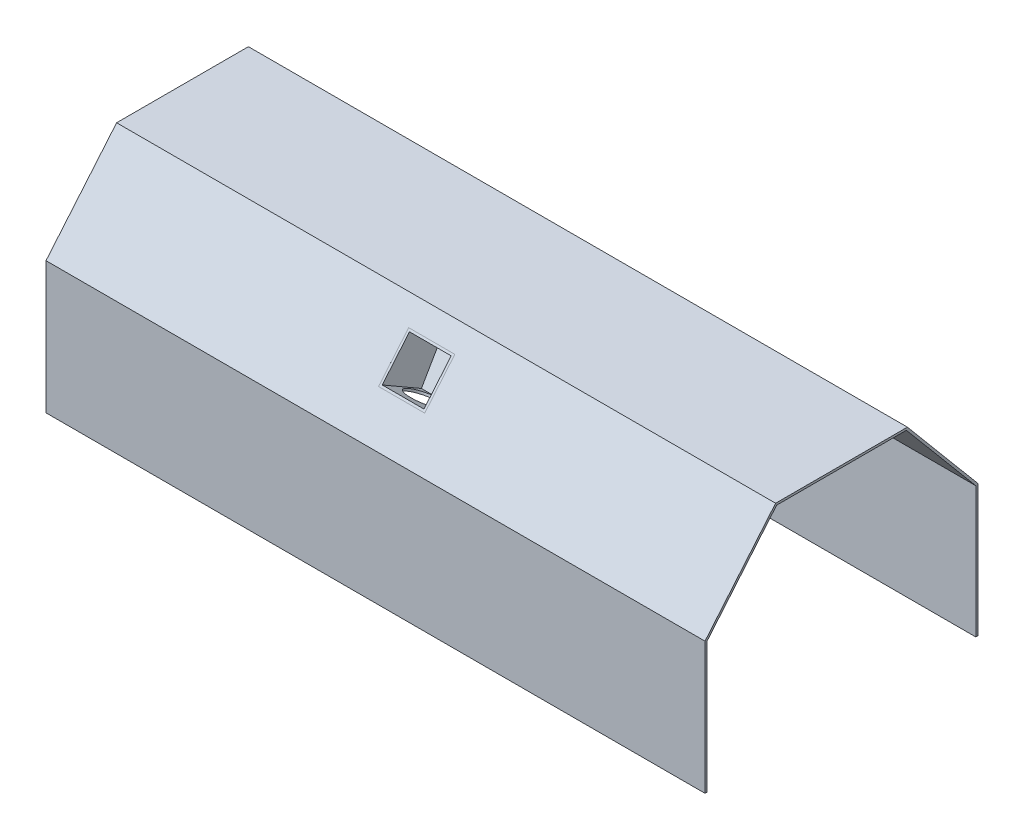
ISO-10303-21;
HEADER;
FILE_DESCRIPTION(('STEP AP214'),'2;1');
FILE_NAME('part.step','',(''),(''),'','','');
FILE_SCHEMA(('AUTOMOTIVE_DESIGN { 1 0 10303 214 1 1 1 1 }'));
ENDSEC;
DATA;
#1=APPLICATION_CONTEXT('core data for automotive mechanical design processes');
#2=APPLICATION_PROTOCOL_DEFINITION('international standard','automotive_design',2000,#1);
#3=PRODUCT_CONTEXT('',#1,'mechanical');
#4=PRODUCT('Part','Part','',(#3));
#5=PRODUCT_RELATED_PRODUCT_CATEGORY('part','',(#4));
#6=PRODUCT_DEFINITION_FORMATION('','',#4);
#7=PRODUCT_DEFINITION_CONTEXT('part definition',#1,'design');
#8=PRODUCT_DEFINITION('design','',#6,#7);
#9=PRODUCT_DEFINITION_SHAPE('','',#8);
#10=(LENGTH_UNIT() NAMED_UNIT(*) SI_UNIT(.MILLI.,.METRE.));
#11=(NAMED_UNIT(*) PLANE_ANGLE_UNIT() SI_UNIT($,.RADIAN.));
#12=(NAMED_UNIT(*) SI_UNIT($,.STERADIAN.) SOLID_ANGLE_UNIT());
#13=UNCERTAINTY_MEASURE_WITH_UNIT(LENGTH_MEASURE(1.E-05),#10,'distance_accuracy_value','');
#14=(GEOMETRIC_REPRESENTATION_CONTEXT(3) GLOBAL_UNCERTAINTY_ASSIGNED_CONTEXT((#13)) GLOBAL_UNIT_ASSIGNED_CONTEXT((#10,
#11,#12)) REPRESENTATION_CONTEXT('',''));
#15=CARTESIAN_POINT('',(0.,0.,0.));
#16=DIRECTION('',(0.,0.,1.));
#17=DIRECTION('',(1.,0.,0.));
#18=AXIS2_PLACEMENT_3D('',#15,#16,#17);
#19=CARTESIAN_POINT('',(150.,97.6575505706655,-91.3710908065221));
#20=DIRECTION('',(0.,-0.64278760968654,0.766044443118977));
#21=DIRECTION('',(0.,-0.766044443118977,-0.64278760968654));
#22=AXIS2_PLACEMENT_3D('',#19,#20,#21);
#23=PLANE('',#22);
#24=DIRECTION('',(0.,-0.766044443118977,-0.64278760968654));
#25=VECTOR('',#24,1.);
#26=CARTESIAN_POINT('',(-150.,97.6575505706654,-91.3710908065221));
#27=LINE('',#26,#25);
#28=CARTESIAN_POINT('',(-150.,97.3008437435062,-91.6704033736298));
#29=VERTEX_POINT('',#28);
#30=CARTESIAN_POINT('',(-150.,59.6314700236338,-123.278760968654));
#31=VERTEX_POINT('',#30);
#32=EDGE_CURVE('E330',#29,#31,#27,.T.);
#33=ORIENTED_EDGE('',*,*,#32,.T.);
#34=DIRECTION('',(1.,0.,0.));
#35=VECTOR('',#34,1.);
#36=CARTESIAN_POINT('',(150.,59.6314700236338,-123.278760968654));
#37=LINE('',#36,#35);
#38=CARTESIAN_POINT('',(150.,59.6314700236338,-123.278760968654));
#39=VERTEX_POINT('',#38);
#40=EDGE_CURVE('E390',#31,#39,#37,.T.);
#41=ORIENTED_EDGE('',*,*,#40,.T.);
#42=DIRECTION('',(0.,-0.766044443118977,-0.64278760968654));
#43=VECTOR('',#42,1.);
#44=CARTESIAN_POINT('',(150.,97.6575505706655,-91.3710908065221));
#45=LINE('',#44,#43);
#46=CARTESIAN_POINT('',(150.,97.3008437435062,-91.6704033736299));
#47=VERTEX_POINT('',#46);
#48=EDGE_CURVE('E327',#47,#39,#45,.T.);
#49=ORIENTED_EDGE('',*,*,#48,.F.);
#50=DIRECTION('',(1.,0.,0.));
#51=VECTOR('',#50,1.);
#52=CARTESIAN_POINT('',(150.,97.3008437435062,-91.6704033736299));
#53=LINE('',#52,#51);
#54=EDGE_CURVE('E388',#29,#47,#53,.T.);
#55=ORIENTED_EDGE('',*,*,#54,.F.);
#56=EDGE_LOOP('',(#33,#41,#49,#55));
#57=FACE_BOUND('',#56,.T.);
#58=ADVANCED_FACE('F37',(#57),#23,.T.);
#59=CARTESIAN_POINT('',(150.,97.6575505706655,-32.907670162132));
#60=DIRECTION('',(0.,0.64278760968654,0.766044443118977));
#61=DIRECTION('',(0.,-0.766044443118977,0.64278760968654));
#62=AXIS2_PLACEMENT_3D('',#59,#60,#61);
#63=PLANE('',#62);
#64=DIRECTION('',(0.,-0.766044443118977,0.64278760968654));
#65=VECTOR('',#64,1.);
#66=CARTESIAN_POINT('',(-10.5,97.6575505706654,-32.9076701621319));
#67=LINE('',#66,#65);
#68=CARTESIAN_POINT('',(-10.5,90.0144016355602,-26.4943067096521));
#69=VERTEX_POINT('',#68);
#70=CARTESIAN_POINT('',(-10.5,73.6793014535259,-12.7875301716632));
#71=VERTEX_POINT('',#70);
#72=EDGE_CURVE('E295',#69,#71,#67,.T.);
#73=ORIENTED_EDGE('',*,*,#72,.T.);
#74=DIRECTION('',(1.,0.,0.));
#75=VECTOR('',#74,1.);
#76=CARTESIAN_POINT('',(150.,73.6793014535259,-12.7875301716631));
#77=LINE('',#76,#75);
#78=CARTESIAN_POINT('',(10.5,73.6793014535259,-12.7875301716632));
#79=VERTEX_POINT('',#78);
#80=EDGE_CURVE('E298',#71,#79,#77,.T.);
#81=ORIENTED_EDGE('',*,*,#80,.T.);
#82=DIRECTION('',(0.,0.766044443118977,-0.64278760968654));
#83=VECTOR('',#82,1.);
#84=CARTESIAN_POINT('',(10.5,97.6575505706655,-32.907670162132));
#85=LINE('',#84,#83);
#86=CARTESIAN_POINT('',(10.5,90.0144016355602,-26.4943067096521));
#87=VERTEX_POINT('',#86);
#88=EDGE_CURVE('E283',#79,#87,#85,.T.);
#89=ORIENTED_EDGE('',*,*,#88,.T.);
#90=DIRECTION('',(-1.,0.,0.));
#91=VECTOR('',#90,1.);
#92=CARTESIAN_POINT('',(150.,90.0144016355602,-26.4943067096521));
#93=LINE('',#92,#91);
#94=EDGE_CURVE('E292',#87,#69,#93,.T.);
#95=ORIENTED_EDGE('',*,*,#94,.T.);
#96=EDGE_LOOP('',(#73,#81,#89,#95));
#97=FACE_BOUND('',#96,.T.);
#98=DIRECTION('',(-1.,0.,0.));
#99=VECTOR('',#98,1.);
#100=CARTESIAN_POINT('',(150.,97.3008437435062,-32.6083575950242));
#101=LINE('',#100,#99);
#102=CARTESIAN_POINT('',(150.,97.3008437435063,-32.6083575950242));
#103=VERTEX_POINT('',#102);
#104=CARTESIAN_POINT('',(-150.,97.3008437435062,-32.6083575950243));
#105=VERTEX_POINT('',#104);
#106=EDGE_CURVE('E385',#103,#105,#101,.T.);
#107=ORIENTED_EDGE('',*,*,#106,.F.);
#108=DIRECTION('',(0.,-0.766044443118977,0.64278760968654));
#109=VECTOR('',#108,1.);
#110=CARTESIAN_POINT('',(150.,97.6575505706655,-32.907670162132));
#111=LINE('',#110,#109);
#112=CARTESIAN_POINT('',(150.,59.6314700236338,-0.999999999999994));
#113=VERTEX_POINT('',#112);
#114=EDGE_CURVE('E354',#103,#113,#111,.T.);
#115=ORIENTED_EDGE('',*,*,#114,.T.);
#116=DIRECTION('',(-1.,0.,0.));
#117=VECTOR('',#116,1.);
#118=CARTESIAN_POINT('',(0.,59.6314700236338,-1.));
#119=LINE('',#118,#117);
#120=CARTESIAN_POINT('',(-150.,59.6314700236337,-0.999999999999997));
#121=VERTEX_POINT('',#120);
#122=EDGE_CURVE('E381',#113,#121,#119,.T.);
#123=ORIENTED_EDGE('',*,*,#122,.T.);
#124=DIRECTION('',(0.,-0.766044443118977,0.64278760968654));
#125=VECTOR('',#124,1.);
#126=CARTESIAN_POINT('',(-150.,97.6575505706654,-32.907670162132));
#127=LINE('',#126,#125);
#128=EDGE_CURVE('E352',#105,#121,#127,.T.);
#129=ORIENTED_EDGE('',*,*,#128,.F.);
#130=EDGE_LOOP('',(#107,#115,#123,#129));
#131=FACE_BOUND('',#130,.T.);
#132=ADVANCED_FACE('F449',(#97,#131),#63,.F.);
#133=CARTESIAN_POINT('',(0.,0.,-1.));
#134=DIRECTION('',(0.,0.,1.));
#135=DIRECTION('',(1.,0.,0.));
#136=AXIS2_PLACEMENT_3D('',#133,#134,#135);
#137=PLANE('',#136);
#138=ORIENTED_EDGE('',*,*,#122,.F.);
#139=DIRECTION('',(0.,1.,0.));
#140=VECTOR('',#139,1.);
#141=CARTESIAN_POINT('',(150.,0.,-1.));
#142=LINE('',#141,#140);
#143=CARTESIAN_POINT('',(150.,0.,-1.));
#144=VERTEX_POINT('',#143);
#145=EDGE_CURVE('E365',#144,#113,#142,.T.);
#146=ORIENTED_EDGE('',*,*,#145,.F.);
#147=DIRECTION('',(1.,0.,0.));
#148=VECTOR('',#147,1.);
#149=CARTESIAN_POINT('',(-150.,0.,-1.));
#150=LINE('',#149,#148);
#151=CARTESIAN_POINT('',(-150.,0.,-1.));
#152=VERTEX_POINT('',#151);
#153=EDGE_CURVE('E361',#152,#144,#150,.T.);
#154=ORIENTED_EDGE('',*,*,#153,.F.);
#155=DIRECTION('',(0.,-1.,0.));
#156=VECTOR('',#155,1.);
#157=CARTESIAN_POINT('',(-150.,60.,-1.));
#158=LINE('',#157,#156);
#159=EDGE_CURVE('E359',#121,#152,#158,.T.);
#160=ORIENTED_EDGE('',*,*,#159,.F.);
#161=EDGE_LOOP('',(#138,#146,#154,#160));
#162=FACE_BOUND('',#161,.T.);
#163=ADVANCED_FACE('F455',(#162),#137,.F.);
#164=CARTESIAN_POINT('',(-150.,60.,-1.));
#165=DIRECTION('',(-1.,0.,0.));
#166=DIRECTION('',(0.,-1.,0.));
#167=AXIS2_PLACEMENT_3D('',#164,#165,#166);
#168=PLANE('',#167);
#169=DIRECTION('',(0.,-1.,0.));
#170=VECTOR('',#169,1.);
#171=CARTESIAN_POINT('',(-150.,60.,-123.278760968654));
#172=LINE('',#171,#170);
#173=CARTESIAN_POINT('',(-150.,0.,-123.278760968654));
#174=VERTEX_POINT('',#173);
#175=EDGE_CURVE('E302',#31,#174,#172,.T.);
#176=ORIENTED_EDGE('',*,*,#175,.F.);
#177=ORIENTED_EDGE('',*,*,#32,.F.);
#178=DIRECTION('',(0.,0.,1.));
#179=VECTOR('',#178,1.);
#180=CARTESIAN_POINT('',(-150.,97.3008437435062,-92.139380484327));
#181=LINE('',#180,#179);
#182=EDGE_CURVE('E343',#29,#105,#181,.T.);
#183=ORIENTED_EDGE('',*,*,#182,.T.);
#184=ORIENTED_EDGE('',*,*,#128,.T.);
#185=ORIENTED_EDGE('',*,*,#159,.T.);
#186=DIRECTION('',(0.,0.,1.));
#187=VECTOR('',#186,1.);
#188=CARTESIAN_POINT('',(-150.,0.,-1.));
#189=LINE('',#188,#187);
#190=CARTESIAN_POINT('',(-150.,0.,0.));
#191=VERTEX_POINT('',#190);
#192=EDGE_CURVE('E368',#152,#191,#189,.T.);
#193=ORIENTED_EDGE('',*,*,#192,.T.);
#194=DIRECTION('',(0.,-1.,0.));
#195=VECTOR('',#194,1.);
#196=CARTESIAN_POINT('',(-150.,60.,0.));
#197=LINE('',#196,#195);
#198=CARTESIAN_POINT('',(-150.,60.,0.));
#199=VERTEX_POINT('',#198);
#200=EDGE_CURVE('E358',#199,#191,#197,.T.);
#201=ORIENTED_EDGE('',*,*,#200,.F.);
#202=DIRECTION('',(0.,-0.766044443118977,0.64278760968654));
#203=VECTOR('',#202,1.);
#204=CARTESIAN_POINT('',(-150.,98.3022221559489,-32.139380484327));
#205=LINE('',#204,#203);
#206=CARTESIAN_POINT('',(-150.,98.3022221559489,-32.139380484327));
#207=VERTEX_POINT('',#206);
#208=EDGE_CURVE('E350',#207,#199,#205,.T.);
#209=ORIENTED_EDGE('',*,*,#208,.F.);
#210=DIRECTION('',(0.,0.,1.));
#211=VECTOR('',#210,1.);
#212=CARTESIAN_POINT('',(-150.,98.3022221559489,-92.139380484327));
#213=LINE('',#212,#211);
#214=CARTESIAN_POINT('',(-150.,98.3022221559489,-92.139380484327));
#215=VERTEX_POINT('',#214);
#216=EDGE_CURVE('E340',#215,#207,#213,.T.);
#217=ORIENTED_EDGE('',*,*,#216,.F.);
#218=DIRECTION('',(0.,-0.766044443118977,-0.64278760968654));
#219=VECTOR('',#218,1.);
#220=CARTESIAN_POINT('',(-150.,98.3022221559489,-92.139380484327));
#221=LINE('',#220,#219);
#222=CARTESIAN_POINT('',(-150.,60.,-124.278760968654));
#223=VERTEX_POINT('',#222);
#224=EDGE_CURVE('E332',#215,#223,#221,.T.);
#225=ORIENTED_EDGE('',*,*,#224,.T.);
#226=DIRECTION('',(0.,-1.,0.));
#227=VECTOR('',#226,1.);
#228=CARTESIAN_POINT('',(-150.,60.,-124.278760968654));
#229=LINE('',#228,#227);
#230=CARTESIAN_POINT('',(-150.,0.,-124.278760968654));
#231=VERTEX_POINT('',#230);
#232=EDGE_CURVE('E301',#223,#231,#229,.T.);
#233=ORIENTED_EDGE('',*,*,#232,.T.);
#234=DIRECTION('',(0.,0.,-1.));
#235=VECTOR('',#234,1.);
#236=CARTESIAN_POINT('',(-150.,0.,-123.278760968654));
#237=LINE('',#236,#235);
#238=EDGE_CURVE('E317',#174,#231,#237,.T.);
#239=ORIENTED_EDGE('',*,*,#238,.F.);
#240=EDGE_LOOP('',(#176,#177,#183,#184,#185,#193,#201,#209,#217,#225,#233,#239));
#241=FACE_BOUND('',#240,.T.);
#242=ADVANCED_FACE('F39',(#241),#168,.T.);
#243=CARTESIAN_POINT('',(150.,0.,-1.));
#244=DIRECTION('',(1.,0.,0.));
#245=DIRECTION('',(0.,1.,0.));
#246=AXIS2_PLACEMENT_3D('',#243,#244,#245);
#247=PLANE('',#246);
#248=DIRECTION('',(0.,1.,0.));
#249=VECTOR('',#248,1.);
#250=CARTESIAN_POINT('',(150.,0.,-124.278760968654));
#251=LINE('',#250,#249);
#252=CARTESIAN_POINT('',(150.,0.,-124.278760968654));
#253=VERTEX_POINT('',#252);
#254=CARTESIAN_POINT('',(150.,60.0000000000001,-124.278760968654));
#255=VERTEX_POINT('',#254);
#256=EDGE_CURVE('E313',#253,#255,#251,.T.);
#257=ORIENTED_EDGE('',*,*,#256,.T.);
#258=DIRECTION('',(0.,-0.766044443118977,-0.64278760968654));
#259=VECTOR('',#258,1.);
#260=CARTESIAN_POINT('',(150.,98.3022221559489,-92.139380484327));
#261=LINE('',#260,#259);
#262=CARTESIAN_POINT('',(150.,98.3022221559489,-92.139380484327));
#263=VERTEX_POINT('',#262);
#264=EDGE_CURVE('E325',#263,#255,#261,.T.);
#265=ORIENTED_EDGE('',*,*,#264,.F.);
#266=DIRECTION('',(0.,0.,1.));
#267=VECTOR('',#266,1.);
#268=CARTESIAN_POINT('',(150.,98.3022221559489,-92.139380484327));
#269=LINE('',#268,#267);
#270=CARTESIAN_POINT('',(150.,98.3022221559489,-32.139380484327));
#271=VERTEX_POINT('',#270);
#272=EDGE_CURVE('E337',#263,#271,#269,.T.);
#273=ORIENTED_EDGE('',*,*,#272,.T.);
#274=DIRECTION('',(0.,-0.766044443118977,0.64278760968654));
#275=VECTOR('',#274,1.);
#276=CARTESIAN_POINT('',(150.,98.3022221559489,-32.139380484327));
#277=LINE('',#276,#275);
#278=CARTESIAN_POINT('',(150.,60.,0.));
#279=VERTEX_POINT('',#278);
#280=EDGE_CURVE('E356',#271,#279,#277,.T.);
#281=ORIENTED_EDGE('',*,*,#280,.T.);
#282=DIRECTION('',(0.,1.,0.));
#283=VECTOR('',#282,1.);
#284=CARTESIAN_POINT('',(150.,0.,0.));
#285=LINE('',#284,#283);
#286=CARTESIAN_POINT('',(150.,0.,0.));
#287=VERTEX_POINT('',#286);
#288=EDGE_CURVE('E374',#287,#279,#285,.T.);
#289=ORIENTED_EDGE('',*,*,#288,.F.);
#290=DIRECTION('',(0.,0.,1.));
#291=VECTOR('',#290,1.);
#292=CARTESIAN_POINT('',(150.,0.,-1.));
#293=LINE('',#292,#291);
#294=EDGE_CURVE('E379',#144,#287,#293,.T.);
#295=ORIENTED_EDGE('',*,*,#294,.F.);
#296=ORIENTED_EDGE('',*,*,#145,.T.);
#297=ORIENTED_EDGE('',*,*,#114,.F.);
#298=DIRECTION('',(0.,0.,1.));
#299=VECTOR('',#298,1.);
#300=CARTESIAN_POINT('',(150.,97.3008437435062,-92.139380484327));
#301=LINE('',#300,#299);
#302=EDGE_CURVE('E345',#47,#103,#301,.T.);
#303=ORIENTED_EDGE('',*,*,#302,.F.);
#304=ORIENTED_EDGE('',*,*,#48,.T.);
#305=DIRECTION('',(0.,1.,0.));
#306=VECTOR('',#305,1.);
#307=CARTESIAN_POINT('',(150.,0.,-123.278760968654));
#308=LINE('',#307,#306);
#309=CARTESIAN_POINT('',(150.,0.,-123.278760968654));
#310=VERTEX_POINT('',#309);
#311=EDGE_CURVE('E304',#310,#39,#308,.T.);
#312=ORIENTED_EDGE('',*,*,#311,.F.);
#313=DIRECTION('',(0.,0.,-1.));
#314=VECTOR('',#313,1.);
#315=CARTESIAN_POINT('',(150.,0.,-123.278760968654));
#316=LINE('',#315,#314);
#317=EDGE_CURVE('E310',#310,#253,#316,.T.);
#318=ORIENTED_EDGE('',*,*,#317,.T.);
#319=EDGE_LOOP('',(#257,#265,#273,#281,#289,#295,#296,#297,#303,#304,#312,#318));
#320=FACE_BOUND('',#319,.T.);
#321=ADVANCED_FACE('F484',(#320),#247,.T.);
#322=CARTESIAN_POINT('',(-150.,0.,-1.));
#323=DIRECTION('',(0.,-1.,0.));
#324=DIRECTION('',(1.,0.,0.));
#325=AXIS2_PLACEMENT_3D('',#322,#323,#324);
#326=PLANE('',#325);
#327=DIRECTION('',(1.,0.,0.));
#328=VECTOR('',#327,1.);
#329=CARTESIAN_POINT('',(-150.,0.,0.));
#330=LINE('',#329,#328);
#331=EDGE_CURVE('E371',#191,#287,#330,.T.);
#332=ORIENTED_EDGE('',*,*,#331,.F.);
#333=ORIENTED_EDGE('',*,*,#192,.F.);
#334=ORIENTED_EDGE('',*,*,#153,.T.);
#335=ORIENTED_EDGE('',*,*,#294,.T.);
#336=EDGE_LOOP('',(#332,#333,#334,#335));
#337=FACE_BOUND('',#336,.T.);
#338=ADVANCED_FACE('F482',(#337),#326,.T.);
#339=CARTESIAN_POINT('',(0.,0.,0.));
#340=DIRECTION('',(0.,0.,1.));
#341=DIRECTION('',(1.,0.,0.));
#342=AXIS2_PLACEMENT_3D('',#339,#340,#341);
#343=PLANE('',#342);
#344=ORIENTED_EDGE('',*,*,#200,.T.);
#345=ORIENTED_EDGE('',*,*,#331,.T.);
#346=ORIENTED_EDGE('',*,*,#288,.T.);
#347=DIRECTION('',(-1.,0.,0.));
#348=VECTOR('',#347,1.);
#349=CARTESIAN_POINT('',(150.,60.0000000000001,0.));
#350=LINE('',#349,#348);
#351=EDGE_CURVE('E362',#279,#199,#350,.T.);
#352=ORIENTED_EDGE('',*,*,#351,.T.);
#353=EDGE_LOOP('',(#344,#345,#346,#352));
#354=FACE_BOUND('',#353,.T.);
#355=ADVANCED_FACE('F476',(#354),#343,.T.);
#356=CARTESIAN_POINT('',(-150.,98.3022221559489,-32.139380484327));
#357=DIRECTION('',(0.,-0.64278760968654,-0.766044443118977));
#358=DIRECTION('',(0.,0.766044443118977,-0.64278760968654));
#359=AXIS2_PLACEMENT_3D('',#356,#357,#358);
#360=PLANE('',#359);
#361=DIRECTION('',(0.,-0.766044443118977,0.64278760968654));
#362=VECTOR('',#361,1.);
#363=CARTESIAN_POINT('',(10.5,98.3022221559489,-32.139380484327));
#364=LINE('',#363,#362);
#365=CARTESIAN_POINT('',(10.5,90.5236030216468,-25.6123440376656));
#366=VERTEX_POINT('',#365);
#367=CARTESIAN_POINT('',(10.5,74.1885028396125,-11.9055674996767));
#368=VERTEX_POINT('',#367);
#369=EDGE_CURVE('E392',#366,#368,#364,.T.);
#370=ORIENTED_EDGE('',*,*,#369,.T.);
#371=DIRECTION('',(-1.,0.,0.));
#372=VECTOR('',#371,1.);
#373=CARTESIAN_POINT('',(-150.,74.1885028396125,-11.9055674996767));
#374=LINE('',#373,#372);
#375=CARTESIAN_POINT('',(-10.5,74.1885028396125,-11.9055674996767));
#376=VERTEX_POINT('',#375);
#377=EDGE_CURVE('E11',#368,#376,#374,.T.);
#378=ORIENTED_EDGE('',*,*,#377,.T.);
#379=DIRECTION('',(0.,0.766044443118977,-0.64278760968654));
#380=VECTOR('',#379,1.);
#381=CARTESIAN_POINT('',(-10.5,98.3022221559489,-32.1393804843271));
#382=LINE('',#381,#380);
#383=CARTESIAN_POINT('',(-10.5,90.5236030216468,-25.6123440376656));
#384=VERTEX_POINT('',#383);
#385=EDGE_CURVE('E45',#376,#384,#382,.T.);
#386=ORIENTED_EDGE('',*,*,#385,.T.);
#387=DIRECTION('',(1.,0.,0.));
#388=VECTOR('',#387,1.);
#389=CARTESIAN_POINT('',(-150.,90.5236030216468,-25.6123440376656));
#390=LINE('',#389,#388);
#391=EDGE_CURVE('E395',#384,#366,#390,.T.);
#392=ORIENTED_EDGE('',*,*,#391,.T.);
#393=EDGE_LOOP('',(#370,#378,#386,#392));
#394=FACE_BOUND('',#393,.T.);
#395=ORIENTED_EDGE('',*,*,#351,.F.);
#396=ORIENTED_EDGE('',*,*,#280,.F.);
#397=DIRECTION('',(1.,0.,0.));
#398=VECTOR('',#397,1.);
#399=CARTESIAN_POINT('',(-150.,98.3022221559489,-32.139380484327));
#400=LINE('',#399,#398);
#401=EDGE_CURVE('E347',#207,#271,#400,.T.);
#402=ORIENTED_EDGE('',*,*,#401,.F.);
#403=ORIENTED_EDGE('',*,*,#208,.T.);
#404=EDGE_LOOP('',(#395,#396,#402,#403));
#405=FACE_BOUND('',#404,.T.);
#406=ADVANCED_FACE('F400',(#394,#405),#360,.F.);
#407=CARTESIAN_POINT('',(150.,97.3008437435062,-92.139380484327));
#408=DIRECTION('',(0.,1.,0.));
#409=DIRECTION('',(0.,0.,1.));
#410=AXIS2_PLACEMENT_3D('',#407,#408,#409);
#411=PLANE('',#410);
#412=ORIENTED_EDGE('',*,*,#182,.F.);
#413=ORIENTED_EDGE('',*,*,#54,.T.);
#414=ORIENTED_EDGE('',*,*,#302,.T.);
#415=ORIENTED_EDGE('',*,*,#106,.T.);
#416=EDGE_LOOP('',(#412,#413,#414,#415));
#417=FACE_BOUND('',#416,.T.);
#418=ADVANCED_FACE('F469',(#417),#411,.F.);
#419=CARTESIAN_POINT('',(-150.,98.3022221559489,-92.139380484327));
#420=DIRECTION('',(0.,-1.,0.));
#421=DIRECTION('',(1.,0.,0.));
#422=AXIS2_PLACEMENT_3D('',#419,#420,#421);
#423=PLANE('',#422);
#424=ORIENTED_EDGE('',*,*,#401,.T.);
#425=ORIENTED_EDGE('',*,*,#272,.F.);
#426=DIRECTION('',(1.,0.,0.));
#427=VECTOR('',#426,1.);
#428=CARTESIAN_POINT('',(-150.,98.3022221559489,-92.139380484327));
#429=LINE('',#428,#427);
#430=EDGE_CURVE('E334',#215,#263,#429,.T.);
#431=ORIENTED_EDGE('',*,*,#430,.F.);
#432=ORIENTED_EDGE('',*,*,#216,.T.);
#433=EDGE_LOOP('',(#424,#425,#431,#432));
#434=FACE_BOUND('',#433,.T.);
#435=ADVANCED_FACE('F465',(#434),#423,.F.);
#436=CARTESIAN_POINT('',(-150.,98.3022221559489,-92.139380484327));
#437=DIRECTION('',(0.,0.64278760968654,-0.766044443118977));
#438=DIRECTION('',(0.,0.766044443118977,0.64278760968654));
#439=AXIS2_PLACEMENT_3D('',#436,#437,#438);
#440=PLANE('',#439);
#441=DIRECTION('',(1.,0.,0.));
#442=VECTOR('',#441,1.);
#443=CARTESIAN_POINT('',(-150.,60.,-124.278760968654));
#444=LINE('',#443,#442);
#445=EDGE_CURVE('E320',#223,#255,#444,.T.);
#446=ORIENTED_EDGE('',*,*,#445,.F.);
#447=ORIENTED_EDGE('',*,*,#224,.F.);
#448=ORIENTED_EDGE('',*,*,#430,.T.);
#449=ORIENTED_EDGE('',*,*,#264,.T.);
#450=EDGE_LOOP('',(#446,#447,#448,#449));
#451=FACE_BOUND('',#450,.T.);
#452=ADVANCED_FACE('F462',(#451),#440,.T.);
#453=CARTESIAN_POINT('',(-150.,0.,-123.278760968654));
#454=DIRECTION('',(0.,1.,0.));
#455=DIRECTION('',(-1.,0.,0.));
#456=AXIS2_PLACEMENT_3D('',#453,#454,#455);
#457=PLANE('',#456);
#458=DIRECTION('',(1.,0.,0.));
#459=VECTOR('',#458,1.);
#460=CARTESIAN_POINT('',(-150.,0.,-124.278760968654));
#461=LINE('',#460,#459);
#462=EDGE_CURVE('E305',#231,#253,#461,.T.);
#463=ORIENTED_EDGE('',*,*,#462,.T.);
#464=ORIENTED_EDGE('',*,*,#317,.F.);
#465=DIRECTION('',(1.,0.,0.));
#466=VECTOR('',#465,1.);
#467=CARTESIAN_POINT('',(-150.,0.,-123.278760968654));
#468=LINE('',#467,#466);
#469=EDGE_CURVE('E308',#174,#310,#468,.T.);
#470=ORIENTED_EDGE('',*,*,#469,.F.);
#471=ORIENTED_EDGE('',*,*,#238,.T.);
#472=EDGE_LOOP('',(#463,#464,#470,#471));
#473=FACE_BOUND('',#472,.T.);
#474=ADVANCED_FACE('F460',(#473),#457,.F.);
#475=CARTESIAN_POINT('',(0.,0.,-123.278760968654));
#476=DIRECTION('',(0.,0.,-1.));
#477=DIRECTION('',(1.,0.,0.));
#478=AXIS2_PLACEMENT_3D('',#475,#476,#477);
#479=PLANE('',#478);
#480=ORIENTED_EDGE('',*,*,#40,.F.);
#481=ORIENTED_EDGE('',*,*,#175,.T.);
#482=ORIENTED_EDGE('',*,*,#469,.T.);
#483=ORIENTED_EDGE('',*,*,#311,.T.);
#484=EDGE_LOOP('',(#480,#481,#482,#483));
#485=FACE_BOUND('',#484,.T.);
#486=ADVANCED_FACE('F521',(#485),#479,.F.);
#487=CARTESIAN_POINT('',(0.,0.,-124.278760968654));
#488=DIRECTION('',(0.,0.,-1.));
#489=DIRECTION('',(1.,0.,0.));
#490=AXIS2_PLACEMENT_3D('',#487,#488,#489);
#491=PLANE('',#490);
#492=ORIENTED_EDGE('',*,*,#232,.F.);
#493=ORIENTED_EDGE('',*,*,#445,.T.);
#494=ORIENTED_EDGE('',*,*,#256,.F.);
#495=ORIENTED_EDGE('',*,*,#462,.F.);
#496=EDGE_LOOP('',(#492,#493,#494,#495));
#497=FACE_BOUND('',#496,.T.);
#498=ADVANCED_FACE('F514',(#497),#491,.T.);
#499=CARTESIAN_POINT('',(-10.5,63.2966390803045,-30.7708289199162));
#500=DIRECTION('',(0.,-0.866025403784438,0.500000000000001));
#501=DIRECTION('',(0.,-0.500000000000001,-0.866025403784438));
#502=AXIS2_PLACEMENT_3D('',#499,#500,#501);
#503=PLANE('',#502);
#504=CARTESIAN_POINT('',(0.,67.7966390803046,-22.9766002858563));
#505=DIRECTION('',(0.,-0.866025403784438,0.500000000000001));
#506=DIRECTION('',(0.,-0.500000000000001,-0.866025403784438));
#507=AXIS2_PLACEMENT_3D('',#504,#505,#506);
#508=CIRCLE('',#507,8.5);
#509=CARTESIAN_POINT('',(0.,63.5466390803046,-30.337816218024));
#510=VERTEX_POINT('',#509);
#511=EDGE_CURVE('E215',#510,#510,#508,.T.);
#512=ORIENTED_EDGE('',*,*,#511,.F.);
#513=EDGE_LOOP('',(#512));
#514=FACE_BOUND('',#513,.T.);
#515=ORIENTED_EDGE('',*,*,#80,.F.);
#516=DIRECTION('',(0.,0.500000000000001,0.866025403784438));
#517=VECTOR('',#516,1.);
#518=CARTESIAN_POINT('',(-10.5,63.2966390803045,-30.7708289199162));
#519=LINE('',#518,#517);
#520=CARTESIAN_POINT('',(-10.5,63.2966390803045,-30.7708289199162));
#521=VERTEX_POINT('',#520);
#522=EDGE_CURVE('E280',#521,#71,#519,.T.);
#523=ORIENTED_EDGE('',*,*,#522,.F.);
#524=DIRECTION('',(1.,0.,0.));
#525=VECTOR('',#524,1.);
#526=CARTESIAN_POINT('',(-10.5,63.2966390803045,-30.7708289199162));
#527=LINE('',#526,#525);
#528=CARTESIAN_POINT('',(10.5,63.2966390803045,-30.7708289199162));
#529=VERTEX_POINT('',#528);
#530=EDGE_CURVE('E268',#521,#529,#527,.T.);
#531=ORIENTED_EDGE('',*,*,#530,.T.);
#532=DIRECTION('',(0.,0.500000000000001,0.866025403784438));
#533=VECTOR('',#532,1.);
#534=CARTESIAN_POINT('',(10.5,63.2966390803045,-30.7708289199162));
#535=LINE('',#534,#533);
#536=EDGE_CURVE('E279',#529,#79,#535,.T.);
#537=ORIENTED_EDGE('',*,*,#536,.T.);
#538=EDGE_LOOP('',(#515,#523,#531,#537));
#539=FACE_BOUND('',#538,.T.);
#540=ADVANCED_FACE('F533',(#514,#539),#503,.T.);
#541=CARTESIAN_POINT('',(-10.5,81.4831725597777,-41.2708289199162));
#542=DIRECTION('',(-1.,0.,0.));
#543=DIRECTION('',(0.,-1.,0.));
#544=AXIS2_PLACEMENT_3D('',#541,#542,#543);
#545=PLANE('',#544);
#546=ORIENTED_EDGE('',*,*,#72,.F.);
#547=DIRECTION('',(0.,0.500000000000001,0.866025403784438));
#548=VECTOR('',#547,1.);
#549=CARTESIAN_POINT('',(-10.5,81.4831725597777,-41.2708289199162));
#550=LINE('',#549,#548);
#551=CARTESIAN_POINT('',(-10.5,81.4831725597777,-41.2708289199162));
#552=VERTEX_POINT('',#551);
#553=EDGE_CURVE('E284',#552,#69,#550,.T.);
#554=ORIENTED_EDGE('',*,*,#553,.F.);
#555=DIRECTION('',(0.,-0.866025403784438,0.500000000000001));
#556=VECTOR('',#555,1.);
#557=CARTESIAN_POINT('',(-10.5,81.4831725597777,-41.2708289199162));
#558=LINE('',#557,#556);
#559=EDGE_CURVE('E276',#552,#521,#558,.T.);
#560=ORIENTED_EDGE('',*,*,#559,.T.);
#561=ORIENTED_EDGE('',*,*,#522,.T.);
#562=EDGE_LOOP('',(#546,#554,#560,#561));
#563=FACE_BOUND('',#562,.T.);
#564=ADVANCED_FACE('F537',(#563),#545,.T.);
#565=CARTESIAN_POINT('',(10.5,81.4831725597777,-41.2708289199162));
#566=DIRECTION('',(0.,0.866025403784438,-0.500000000000001));
#567=DIRECTION('',(0.,0.500000000000001,0.866025403784438));
#568=AXIS2_PLACEMENT_3D('',#565,#566,#567);
#569=PLANE('',#568);
#570=ORIENTED_EDGE('',*,*,#94,.F.);
#571=DIRECTION('',(0.,0.500000000000001,0.866025403784438));
#572=VECTOR('',#571,1.);
#573=CARTESIAN_POINT('',(10.5,81.4831725597777,-41.2708289199162));
#574=LINE('',#573,#572);
#575=CARTESIAN_POINT('',(10.5,81.4831725597777,-41.2708289199162));
#576=VERTEX_POINT('',#575);
#577=EDGE_CURVE('E59',#576,#87,#574,.T.);
#578=ORIENTED_EDGE('',*,*,#577,.F.);
#579=DIRECTION('',(-1.,0.,0.));
#580=VECTOR('',#579,1.);
#581=CARTESIAN_POINT('',(10.5,81.4831725597777,-41.2708289199162));
#582=LINE('',#581,#580);
#583=EDGE_CURVE('E273',#576,#552,#582,.T.);
#584=ORIENTED_EDGE('',*,*,#583,.T.);
#585=ORIENTED_EDGE('',*,*,#553,.T.);
#586=EDGE_LOOP('',(#570,#578,#584,#585));
#587=FACE_BOUND('',#586,.T.);
#588=ADVANCED_FACE('F541',(#587),#569,.T.);
#589=CARTESIAN_POINT('',(10.5,63.2966390803045,-30.7708289199162));
#590=DIRECTION('',(1.,0.,0.));
#591=DIRECTION('',(0.,1.,0.));
#592=AXIS2_PLACEMENT_3D('',#589,#590,#591);
#593=PLANE('',#592);
#594=ORIENTED_EDGE('',*,*,#88,.F.);
#595=ORIENTED_EDGE('',*,*,#536,.F.);
#596=DIRECTION('',(0.,0.866025403784438,-0.500000000000001));
#597=VECTOR('',#596,1.);
#598=CARTESIAN_POINT('',(10.5,63.2966390803045,-30.7708289199162));
#599=LINE('',#598,#597);
#600=EDGE_CURVE('E271',#529,#576,#599,.T.);
#601=ORIENTED_EDGE('',*,*,#600,.T.);
#602=ORIENTED_EDGE('',*,*,#577,.T.);
#603=EDGE_LOOP('',(#594,#595,#601,#602));
#604=FACE_BOUND('',#603,.T.);
#605=ADVANCED_FACE('F444',(#604),#593,.T.);
#606=CARTESIAN_POINT('',(0.,2.50000000000004,4.33012701892225));
#607=DIRECTION('',(0.,0.500000000000001,0.866025403784438));
#608=DIRECTION('',(0.,-0.866025403784438,0.500000000000001));
#609=AXIS2_PLACEMENT_3D('',#606,#607,#608);
#610=PLANE('',#609);
#611=ORIENTED_EDGE('',*,*,#530,.F.);
#612=ORIENTED_EDGE('',*,*,#559,.F.);
#613=ORIENTED_EDGE('',*,*,#583,.F.);
#614=ORIENTED_EDGE('',*,*,#600,.F.);
#615=EDGE_LOOP('',(#611,#612,#613,#614));
#616=FACE_BOUND('',#615,.T.);
#617=ADVANCED_FACE('F437',(#616),#610,.F.);
#618=CARTESIAN_POINT('',(10.5,63.2966390803045,-30.7708289199162));
#619=DIRECTION('',(1.,0.,0.));
#620=DIRECTION('',(0.,1.,0.));
#621=AXIS2_PLACEMENT_3D('',#618,#619,#620);
#622=PLANE('',#621);
#623=DIRECTION('',(0.,0.500000000000001,0.866025403784438));
#624=VECTOR('',#623,1.);
#625=CARTESIAN_POINT('',(10.5,81.4831725597777,-41.2708289199162));
#626=LINE('',#625,#624);
#627=CARTESIAN_POINT('',(10.5,90.5221149415031,-25.6149214680803));
#628=VERTEX_POINT('',#627);
#629=EDGE_CURVE('E240',#628,#366,#626,.T.);
#630=ORIENTED_EDGE('',*,*,#629,.F.);
#631=DIRECTION('',(0.,0.766044443118977,-0.64278760968654));
#632=VECTOR('',#631,1.);
#633=CARTESIAN_POINT('',(10.5,98.300338180352,-32.141625719013));
#634=LINE('',#633,#632);
#635=CARTESIAN_POINT('',(10.5,74.1870147594688,-11.9081449300913));
#636=VERTEX_POINT('',#635);
#637=EDGE_CURVE('E257',#636,#628,#634,.T.);
#638=ORIENTED_EDGE('',*,*,#637,.F.);
#639=DIRECTION('',(0.,0.500000000000001,0.866025403784438));
#640=VECTOR('',#639,1.);
#641=CARTESIAN_POINT('',(10.5,63.2966390803045,-30.7708289199162));
#642=LINE('',#641,#640);
#643=EDGE_CURVE('E241',#636,#368,#642,.T.);
#644=ORIENTED_EDGE('',*,*,#643,.T.);
#645=ORIENTED_EDGE('',*,*,#369,.F.);
#646=EDGE_LOOP('',(#630,#638,#644,#645));
#647=FACE_BOUND('',#646,.T.);
#648=ADVANCED_FACE('F435',(#647),#622,.F.);
#649=CARTESIAN_POINT('',(10.5,81.4831725597777,-41.2708289199162));
#650=DIRECTION('',(0.,0.866025403784438,-0.500000000000001));
#651=DIRECTION('',(0.,0.500000000000001,0.866025403784438));
#652=AXIS2_PLACEMENT_3D('',#649,#650,#651);
#653=PLANE('',#652);
#654=DIRECTION('',(0.,0.500000000000001,0.866025403784438));
#655=VECTOR('',#654,1.);
#656=CARTESIAN_POINT('',(-10.5,81.4831725597777,-41.2708289199162));
#657=LINE('',#656,#655);
#658=CARTESIAN_POINT('',(-10.5,90.5221149415031,-25.6149214680803));
#659=VERTEX_POINT('',#658);
#660=EDGE_CURVE('E249',#659,#384,#657,.T.);
#661=ORIENTED_EDGE('',*,*,#660,.F.);
#662=DIRECTION('',(-1.,0.,0.));
#663=VECTOR('',#662,1.);
#664=CARTESIAN_POINT('',(150.,90.5221149415031,-25.6149214680803));
#665=LINE('',#664,#663);
#666=EDGE_CURVE('E265',#628,#659,#665,.T.);
#667=ORIENTED_EDGE('',*,*,#666,.F.);
#668=ORIENTED_EDGE('',*,*,#629,.T.);
#669=ORIENTED_EDGE('',*,*,#391,.F.);
#670=EDGE_LOOP('',(#661,#667,#668,#669));
#671=FACE_BOUND('',#670,.T.);
#672=ADVANCED_FACE('F433',(#671),#653,.F.);
#673=CARTESIAN_POINT('',(-10.5,81.4831725597777,-41.2708289199162));
#674=DIRECTION('',(-1.,0.,0.));
#675=DIRECTION('',(0.,-1.,0.));
#676=AXIS2_PLACEMENT_3D('',#673,#674,#675);
#677=PLANE('',#676);
#678=DIRECTION('',(0.,0.500000000000001,0.866025403784438));
#679=VECTOR('',#678,1.);
#680=CARTESIAN_POINT('',(-10.5,63.2966390803045,-30.7708289199162));
#681=LINE('',#680,#679);
#682=CARTESIAN_POINT('',(-10.5,74.1870147594688,-11.9081449300913));
#683=VERTEX_POINT('',#682);
#684=EDGE_CURVE('E406',#683,#376,#681,.T.);
#685=ORIENTED_EDGE('',*,*,#684,.F.);
#686=DIRECTION('',(0.,-0.766044443118977,0.64278760968654));
#687=VECTOR('',#686,1.);
#688=CARTESIAN_POINT('',(-10.5,98.300338180352,-32.1416257190129));
#689=LINE('',#688,#687);
#690=EDGE_CURVE('E262',#659,#683,#689,.T.);
#691=ORIENTED_EDGE('',*,*,#690,.F.);
#692=ORIENTED_EDGE('',*,*,#660,.T.);
#693=ORIENTED_EDGE('',*,*,#385,.F.);
#694=EDGE_LOOP('',(#685,#691,#692,#693));
#695=FACE_BOUND('',#694,.T.);
#696=ADVANCED_FACE('F405',(#695),#677,.F.);
#697=CARTESIAN_POINT('',(-10.5,63.2966390803045,-30.7708289199162));
#698=DIRECTION('',(0.,-0.866025403784438,0.500000000000001));
#699=DIRECTION('',(0.,-0.500000000000001,-0.866025403784438));
#700=AXIS2_PLACEMENT_3D('',#697,#698,#699);
#701=PLANE('',#700);
#702=ORIENTED_EDGE('',*,*,#643,.F.);
#703=DIRECTION('',(1.,0.,0.));
#704=VECTOR('',#703,1.);
#705=CARTESIAN_POINT('',(150.,74.1870147594688,-11.9081449300913));
#706=LINE('',#705,#704);
#707=EDGE_CURVE('E260',#683,#636,#706,.T.);
#708=ORIENTED_EDGE('',*,*,#707,.F.);
#709=ORIENTED_EDGE('',*,*,#684,.T.);
#710=ORIENTED_EDGE('',*,*,#377,.F.);
#711=EDGE_LOOP('',(#702,#708,#709,#710));
#712=FACE_BOUND('',#711,.T.);
#713=ADVANCED_FACE('F427',(#712),#701,.F.);
#714=CARTESIAN_POINT('',(150.,98.300338180352,-32.141625719013));
#715=DIRECTION('',(0.,0.64278760968654,0.766044443118977));
#716=DIRECTION('',(0.,-0.766044443118977,0.64278760968654));
#717=AXIS2_PLACEMENT_3D('',#714,#715,#716);
#718=PLANE('',#717);
#719=ORIENTED_EDGE('',*,*,#666,.T.);
#720=ORIENTED_EDGE('',*,*,#690,.T.);
#721=ORIENTED_EDGE('',*,*,#707,.T.);
#722=ORIENTED_EDGE('',*,*,#637,.T.);
#723=EDGE_LOOP('',(#719,#720,#721,#722));
#724=FACE_BOUND('',#723,.T.);
#725=DIRECTION('',(0.,-0.766044443118977,0.64278760968654));
#726=VECTOR('',#725,1.);
#727=CARTESIAN_POINT('',(-9.50000000000004,98.300338180352,-32.1416257190129));
#728=LINE('',#727,#726);
#729=CARTESIAN_POINT('',(-9.50000000000003,89.7442530280729,-24.9622178234141));
#730=VERTEX_POINT('',#729);
#731=CARTESIAN_POINT('',(-9.50000000000002,74.964876672899,-12.5608485747575));
#732=VERTEX_POINT('',#731);
#733=EDGE_CURVE('E418',#730,#732,#728,.T.);
#734=ORIENTED_EDGE('',*,*,#733,.F.);
#735=DIRECTION('',(-1.,0.,0.));
#736=VECTOR('',#735,1.);
#737=CARTESIAN_POINT('',(150.,89.7442530280729,-24.9622178234141));
#738=LINE('',#737,#736);
#739=CARTESIAN_POINT('',(9.49999999999998,89.7442530280729,-24.9622178234141));
#740=VERTEX_POINT('',#739);
#741=EDGE_CURVE('E421',#740,#730,#738,.T.);
#742=ORIENTED_EDGE('',*,*,#741,.F.);
#743=DIRECTION('',(0.,0.766044443118977,-0.64278760968654));
#744=VECTOR('',#743,1.);
#745=CARTESIAN_POINT('',(9.49999999999998,98.300338180352,-32.141625719013));
#746=LINE('',#745,#744);
#747=CARTESIAN_POINT('',(9.49999999999998,74.964876672899,-12.5608485747575));
#748=VERTEX_POINT('',#747);
#749=EDGE_CURVE('E245',#748,#740,#746,.T.);
#750=ORIENTED_EDGE('',*,*,#749,.F.);
#751=DIRECTION('',(1.,0.,0.));
#752=VECTOR('',#751,1.);
#753=CARTESIAN_POINT('',(150.,74.964876672899,-12.5608485747575));
#754=LINE('',#753,#752);
#755=EDGE_CURVE('E237',#732,#748,#754,.T.);
#756=ORIENTED_EDGE('',*,*,#755,.F.);
#757=EDGE_LOOP('',(#734,#742,#750,#756));
#758=FACE_BOUND('',#757,.T.);
#759=ADVANCED_FACE('F430',(#724,#758),#718,.T.);
#760=CARTESIAN_POINT('',(-10.5,64.162664484089,-31.2708289199162));
#761=DIRECTION('',(0.,-0.866025403784438,0.500000000000001));
#762=DIRECTION('',(0.,-0.500000000000001,-0.866025403784438));
#763=AXIS2_PLACEMENT_3D('',#760,#761,#762);
#764=PLANE('',#763);
#765=DIRECTION('',(1.,0.,0.));
#766=VECTOR('',#765,1.);
#767=CARTESIAN_POINT('',(0.,64.662664484089,-30.4048035161317));
#768=LINE('',#767,#766);
#769=CARTESIAN_POINT('',(2.87228132326905,64.662664484089,-30.4048035161317));
#770=VERTEX_POINT('',#769);
#771=CARTESIAN_POINT('',(9.49999999999998,64.662664484089,-30.4048035161317));
#772=VERTEX_POINT('',#771);
#773=EDGE_CURVE('E211',#770,#772,#768,.T.);
#774=ORIENTED_EDGE('',*,*,#773,.F.);
#775=CARTESIAN_POINT('',(0.,68.662664484089,-23.4766002858563));
#776=DIRECTION('',(0.,-0.866025403784438,0.500000000000001));
#777=DIRECTION('',(0.,-0.500000000000001,-0.866025403784438));
#778=AXIS2_PLACEMENT_3D('',#775,#776,#777);
#779=CIRCLE('',#778,8.5);
#780=CARTESIAN_POINT('',(-2.87228132326904,64.662664484089,-30.4048035161318));
#781=VERTEX_POINT('',#780);
#782=EDGE_CURVE('E51',#770,#781,#779,.T.);
#783=ORIENTED_EDGE('',*,*,#782,.T.);
#784=CARTESIAN_POINT('',(-9.50000000000002,64.662664484089,-30.4048035161317));
#785=VERTEX_POINT('',#784);
#786=EDGE_CURVE('E210',#785,#781,#768,.T.);
#787=ORIENTED_EDGE('',*,*,#786,.F.);
#788=DIRECTION('',(0.,0.500000000000001,0.866025403784438));
#789=VECTOR('',#788,1.);
#790=CARTESIAN_POINT('',(-9.50000000000002,64.162664484089,-31.2708289199162));
#791=LINE('',#790,#789);
#792=EDGE_CURVE('E424',#785,#732,#791,.T.);
#793=ORIENTED_EDGE('',*,*,#792,.T.);
#794=ORIENTED_EDGE('',*,*,#755,.T.);
#795=DIRECTION('',(0.,0.500000000000001,0.866025403784438));
#796=VECTOR('',#795,1.);
#797=CARTESIAN_POINT('',(9.49999999999998,64.162664484089,-31.2708289199162));
#798=LINE('',#797,#796);
#799=EDGE_CURVE('E236',#772,#748,#798,.T.);
#800=ORIENTED_EDGE('',*,*,#799,.F.);
#801=EDGE_LOOP('',(#774,#783,#787,#793,#794,#800));
#802=FACE_BOUND('',#801,.T.);
#803=ADVANCED_FACE('F219',(#802),#764,.F.);
#804=CARTESIAN_POINT('',(-9.50000000000003,81.4831725597777,-41.2708289199162));
#805=DIRECTION('',(-1.,0.,0.));
#806=DIRECTION('',(0.,-1.,0.));
#807=AXIS2_PLACEMENT_3D('',#804,#805,#806);
#808=PLANE('',#807);
#809=ORIENTED_EDGE('',*,*,#733,.T.);
#810=ORIENTED_EDGE('',*,*,#792,.F.);
#811=DIRECTION('',(0.,-0.866025403784438,0.500000000000001));
#812=VECTOR('',#811,1.);
#813=CARTESIAN_POINT('',(-9.49999999999999,3.00000000000004,5.19615242270669));
#814=LINE('',#813,#812);
#815=CARTESIAN_POINT('',(-9.50000000000003,81.1171471559933,-39.9048035161318));
#816=VERTEX_POINT('',#815);
#817=EDGE_CURVE('E226',#816,#785,#814,.T.);
#818=ORIENTED_EDGE('',*,*,#817,.F.);
#819=DIRECTION('',(0.,0.500000000000001,0.866025403784438));
#820=VECTOR('',#819,1.);
#821=CARTESIAN_POINT('',(-9.50000000000003,80.6171471559933,-40.7708289199162));
#822=LINE('',#821,#820);
#823=EDGE_CURVE('E253',#816,#730,#822,.T.);
#824=ORIENTED_EDGE('',*,*,#823,.T.);
#825=EDGE_LOOP('',(#809,#810,#818,#824));
#826=FACE_BOUND('',#825,.T.);
#827=ADVANCED_FACE('F554',(#826),#808,.F.);
#828=CARTESIAN_POINT('',(10.5,80.6171471559933,-40.7708289199162));
#829=DIRECTION('',(0.,0.866025403784438,-0.500000000000001));
#830=DIRECTION('',(0.,0.500000000000001,0.866025403784438));
#831=AXIS2_PLACEMENT_3D('',#828,#829,#830);
#832=PLANE('',#831);
#833=ORIENTED_EDGE('',*,*,#741,.T.);
#834=ORIENTED_EDGE('',*,*,#823,.F.);
#835=DIRECTION('',(-1.,0.,0.));
#836=VECTOR('',#835,1.);
#837=CARTESIAN_POINT('',(0.,81.1171471559933,-39.9048035161318));
#838=LINE('',#837,#836);
#839=CARTESIAN_POINT('',(9.49999999999998,81.1171471559933,-39.9048035161318));
#840=VERTEX_POINT('',#839);
#841=EDGE_CURVE('E229',#840,#816,#838,.T.);
#842=ORIENTED_EDGE('',*,*,#841,.F.);
#843=DIRECTION('',(0.,0.500000000000001,0.866025403784438));
#844=VECTOR('',#843,1.);
#845=CARTESIAN_POINT('',(9.49999999999998,80.6171471559933,-40.7708289199162));
#846=LINE('',#845,#844);
#847=EDGE_CURVE('E243',#840,#740,#846,.T.);
#848=ORIENTED_EDGE('',*,*,#847,.T.);
#849=EDGE_LOOP('',(#833,#834,#842,#848));
#850=FACE_BOUND('',#849,.T.);
#851=ADVANCED_FACE('F251',(#850),#832,.F.);
#852=CARTESIAN_POINT('',(9.49999999999998,63.2966390803045,-30.7708289199162));
#853=DIRECTION('',(1.,0.,0.));
#854=DIRECTION('',(0.,1.,0.));
#855=AXIS2_PLACEMENT_3D('',#852,#853,#854);
#856=PLANE('',#855);
#857=ORIENTED_EDGE('',*,*,#749,.T.);
#858=ORIENTED_EDGE('',*,*,#847,.F.);
#859=DIRECTION('',(0.,0.866025403784438,-0.500000000000001));
#860=VECTOR('',#859,1.);
#861=CARTESIAN_POINT('',(9.49999999999999,3.00000000000004,5.19615242270668));
#862=LINE('',#861,#860);
#863=EDGE_CURVE('E227',#772,#840,#862,.T.);
#864=ORIENTED_EDGE('',*,*,#863,.F.);
#865=ORIENTED_EDGE('',*,*,#799,.T.);
#866=EDGE_LOOP('',(#857,#858,#864,#865));
#867=FACE_BOUND('',#866,.T.);
#868=ADVANCED_FACE('F242',(#867),#856,.F.);
#869=CARTESIAN_POINT('',(0.,3.00000000000004,5.19615242270668));
#870=DIRECTION('',(0.,0.500000000000001,0.866025403784438));
#871=DIRECTION('',(0.,-0.866025403784438,0.500000000000001));
#872=AXIS2_PLACEMENT_3D('',#869,#870,#871);
#873=PLANE('',#872);
#874=ORIENTED_EDGE('',*,*,#786,.T.);
#875=EDGE_CURVE('E204',#781,#770,#768,.T.);
#876=ORIENTED_EDGE('',*,*,#875,.T.);
#877=ORIENTED_EDGE('',*,*,#773,.T.);
#878=ORIENTED_EDGE('',*,*,#863,.T.);
#879=ORIENTED_EDGE('',*,*,#841,.T.);
#880=ORIENTED_EDGE('',*,*,#817,.T.);
#881=EDGE_LOOP('',(#874,#876,#877,#878,#879,#880));
#882=FACE_BOUND('',#881,.T.);
#883=ADVANCED_FACE('F223',(#882),#873,.T.);
#884=CARTESIAN_POINT('',(0.,68.662664484089,-23.4766002858563));
#885=DIRECTION('',(0.,-0.866025403784438,0.500000000000001));
#886=DIRECTION('',(0.,-0.500000000000001,-0.866025403784438));
#887=AXIS2_PLACEMENT_3D('',#884,#885,#886);
#888=CYLINDRICAL_SURFACE('',#887,8.5);
#889=ORIENTED_EDGE('',*,*,#782,.F.);
#890=EDGE_CURVE('E206',#781,#770,#779,.T.);
#891=ORIENTED_EDGE('',*,*,#890,.F.);
#892=EDGE_LOOP('',(#889,#891));
#893=FACE_BOUND('',#892,.T.);
#894=ORIENTED_EDGE('',*,*,#511,.T.);
#895=EDGE_LOOP('',(#894));
#896=FACE_BOUND('',#895,.T.);
#897=ADVANCED_FACE('F213',(#893,#896),#888,.F.);
#898=CARTESIAN_POINT('',(0.,68.662664484089,-23.4766002858563));
#899=DIRECTION('',(0.,-0.866025403784438,0.500000000000001));
#900=DIRECTION('',(0.,-0.500000000000001,-0.866025403784438));
#901=AXIS2_PLACEMENT_3D('',#898,#899,#900);
#902=PLANE('',#901);
#903=ORIENTED_EDGE('',*,*,#890,.T.);
#904=ORIENTED_EDGE('',*,*,#875,.F.);
#905=EDGE_LOOP('',(#903,#904));
#906=FACE_BOUND('',#905,.T.);
#907=ADVANCED_FACE('F205',(#906),#902,.T.);
#908=CLOSED_SHELL('',(#58,#132,#163,#242,#321,#338,#355,#406,#418,#435,#452,#474,#486,#498,#540,
#564,#588,#605,#617,#648,#672,#696,#713,#759,#803,#827,#851,#868,#883,#897,#907));
#909=MANIFOLD_SOLID_BREP('B2',#908);
#910=ADVANCED_BREP_SHAPE_REPRESENTATION('',(#18,#909),#14);
#911=SHAPE_DEFINITION_REPRESENTATION(#9,#910);
ENDSEC;
END-ISO-10303-21;
